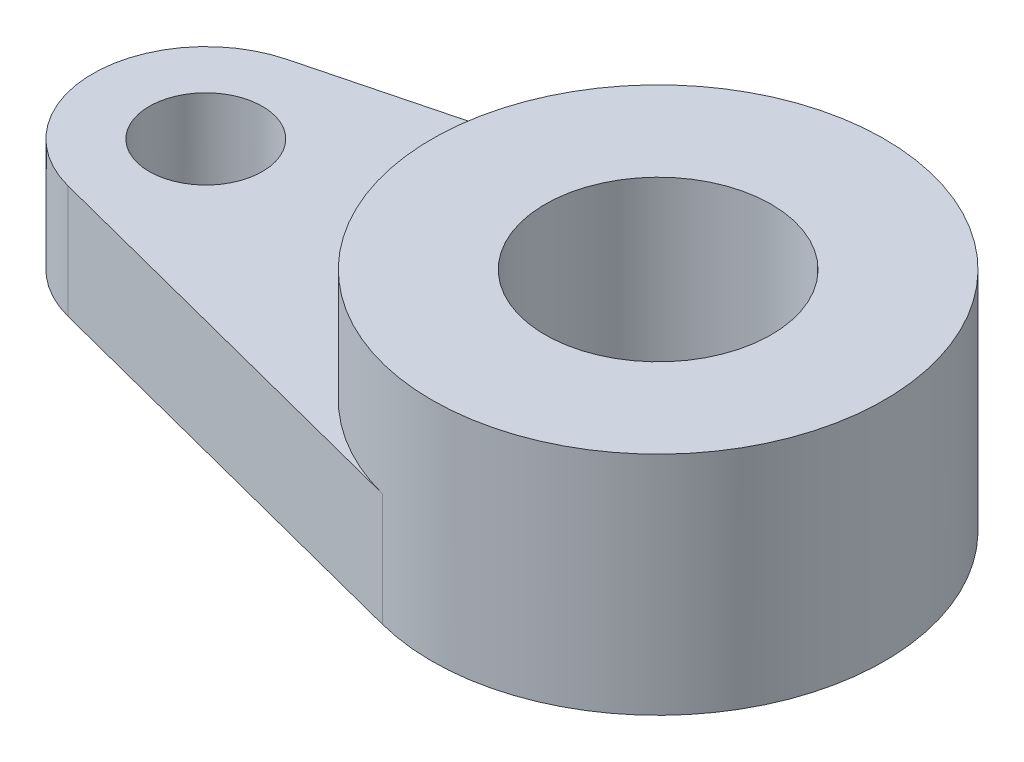
ISO-10303-21;
HEADER;
FILE_DESCRIPTION(('STEP AP214'),'2;1');
FILE_NAME('part.step','',(''),(''),'','','');
FILE_SCHEMA(('AUTOMOTIVE_DESIGN { 1 0 10303 214 1 1 1 1 }'));
ENDSEC;
DATA;
#1=APPLICATION_CONTEXT('core data for automotive mechanical design processes');
#2=APPLICATION_PROTOCOL_DEFINITION('international standard','automotive_design',2000,#1);
#3=PRODUCT_CONTEXT('',#1,'mechanical');
#4=PRODUCT('Part','Part','',(#3));
#5=PRODUCT_RELATED_PRODUCT_CATEGORY('part','',(#4));
#6=PRODUCT_DEFINITION_FORMATION('','',#4);
#7=PRODUCT_DEFINITION_CONTEXT('part definition',#1,'design');
#8=PRODUCT_DEFINITION('design','',#6,#7);
#9=PRODUCT_DEFINITION_SHAPE('','',#8);
#10=(LENGTH_UNIT() NAMED_UNIT(*) SI_UNIT(.MILLI.,.METRE.));
#11=(NAMED_UNIT(*) PLANE_ANGLE_UNIT() SI_UNIT($,.RADIAN.));
#12=(NAMED_UNIT(*) SI_UNIT($,.STERADIAN.) SOLID_ANGLE_UNIT());
#13=UNCERTAINTY_MEASURE_WITH_UNIT(LENGTH_MEASURE(1.E-05),#10,'distance_accuracy_value','');
#14=(GEOMETRIC_REPRESENTATION_CONTEXT(3) GLOBAL_UNCERTAINTY_ASSIGNED_CONTEXT((#13)) GLOBAL_UNIT_ASSIGNED_CONTEXT((#10,
#11,#12)) REPRESENTATION_CONTEXT('',''));
#15=CARTESIAN_POINT('',(0.,0.,0.));
#16=DIRECTION('',(0.,0.,1.));
#17=DIRECTION('',(1.,0.,0.));
#18=AXIS2_PLACEMENT_3D('',#15,#16,#17);
#19=CARTESIAN_POINT('',(0.,6.,0.));
#20=DIRECTION('',(0.,-1.,0.));
#21=DIRECTION('',(0.,0.,-1.));
#22=AXIS2_PLACEMENT_3D('',#19,#20,#21);
#23=CYLINDRICAL_SURFACE('',#22,6.);
#24=CARTESIAN_POINT('',(0.,6.,0.));
#25=DIRECTION('',(0.,1.,0.));
#26=DIRECTION('',(0.,0.,1.));
#27=AXIS2_PLACEMENT_3D('',#24,#25,#26);
#28=CIRCLE('',#27,6.);
#29=CARTESIAN_POINT('',(0.,6.,6.));
#30=VERTEX_POINT('',#29);
#31=EDGE_CURVE('E11',#30,#30,#28,.T.);
#32=ORIENTED_EDGE('',*,*,#31,.F.);
#33=EDGE_LOOP('',(#32));
#34=FACE_BOUND('',#33,.T.);
#35=DIRECTION('',(0.,-1.,0.));
#36=VECTOR('',#35,1.);
#37=CARTESIAN_POINT('',(-1.5,3.,-5.80947501931113));
#38=LINE('',#37,#36);
#39=CARTESIAN_POINT('',(-1.5,3.,-5.80947501931113));
#40=VERTEX_POINT('',#39);
#41=CARTESIAN_POINT('',(-1.5,0.,-5.80947501931113));
#42=VERTEX_POINT('',#41);
#43=EDGE_CURVE('E63',#40,#42,#38,.T.);
#44=ORIENTED_EDGE('',*,*,#43,.F.);
#45=CARTESIAN_POINT('',(0.,3.,0.));
#46=DIRECTION('',(0.,1.,0.));
#47=DIRECTION('',(0.,0.,1.));
#48=AXIS2_PLACEMENT_3D('',#45,#46,#47);
#49=CIRCLE('',#48,6.);
#50=CARTESIAN_POINT('',(-1.5,3.,5.80947501931113));
#51=VERTEX_POINT('',#50);
#52=EDGE_CURVE('E58',#40,#51,#49,.T.);
#53=ORIENTED_EDGE('',*,*,#52,.T.);
#54=DIRECTION('',(0.,-1.,0.));
#55=VECTOR('',#54,1.);
#56=CARTESIAN_POINT('',(-1.5,3.,5.80947501931113));
#57=LINE('',#56,#55);
#58=CARTESIAN_POINT('',(-1.5,0.,5.80947501931113));
#59=VERTEX_POINT('',#58);
#60=EDGE_CURVE('E126',#51,#59,#57,.T.);
#61=ORIENTED_EDGE('',*,*,#60,.T.);
#62=CARTESIAN_POINT('',(0.,0.,0.));
#63=DIRECTION('',(0.,1.,0.));
#64=DIRECTION('',(0.,0.,1.));
#65=AXIS2_PLACEMENT_3D('',#62,#63,#64);
#66=CIRCLE('',#65,6.);
#67=EDGE_CURVE('E50',#59,#42,#66,.T.);
#68=ORIENTED_EDGE('',*,*,#67,.T.);
#69=EDGE_LOOP('',(#44,#53,#61,#68));
#70=FACE_BOUND('',#69,.T.);
#71=ADVANCED_FACE('F41',(#34,#70),#23,.T.);
#72=CARTESIAN_POINT('',(0.,6.,0.));
#73=DIRECTION('',(0.,1.,0.));
#74=DIRECTION('',(0.,0.,1.));
#75=AXIS2_PLACEMENT_3D('',#72,#73,#74);
#76=PLANE('',#75);
#77=CARTESIAN_POINT('',(0.,6.,0.));
#78=DIRECTION('',(0.,-1.,0.));
#79=DIRECTION('',(0.,0.,-1.));
#80=AXIS2_PLACEMENT_3D('',#77,#78,#79);
#81=CIRCLE('',#80,3.);
#82=CARTESIAN_POINT('',(0.,6.,-3.));
#83=VERTEX_POINT('',#82);
#84=EDGE_CURVE('E221',#83,#83,#81,.T.);
#85=ORIENTED_EDGE('',*,*,#84,.T.);
#86=EDGE_LOOP('',(#85));
#87=FACE_BOUND('',#86,.T.);
#88=ORIENTED_EDGE('',*,*,#31,.T.);
#89=EDGE_LOOP('',(#88));
#90=FACE_BOUND('',#89,.T.);
#91=ADVANCED_FACE('F148',(#87,#90),#76,.T.);
#92=CARTESIAN_POINT('',(0.,0.,0.));
#93=DIRECTION('',(0.,1.,0.));
#94=DIRECTION('',(0.,0.,1.));
#95=AXIS2_PLACEMENT_3D('',#92,#93,#94);
#96=PLANE('',#95);
#97=CARTESIAN_POINT('',(0.,0.,0.));
#98=DIRECTION('',(0.,-1.,0.));
#99=DIRECTION('',(0.,0.,-1.));
#100=AXIS2_PLACEMENT_3D('',#97,#98,#99);
#101=CIRCLE('',#100,3.);
#102=CARTESIAN_POINT('',(0.,0.,-3.));
#103=VERTEX_POINT('',#102);
#104=EDGE_CURVE('E219',#103,#103,#101,.T.);
#105=ORIENTED_EDGE('',*,*,#104,.F.);
#106=EDGE_LOOP('',(#105));
#107=FACE_BOUND('',#106,.T.);
#108=CARTESIAN_POINT('',(-12.,0.,0.));
#109=DIRECTION('',(0.,-1.,0.));
#110=DIRECTION('',(0.,0.,-1.));
#111=AXIS2_PLACEMENT_3D('',#108,#109,#110);
#112=CIRCLE('',#111,1.5);
#113=CARTESIAN_POINT('',(-12.,0.,-1.5));
#114=VERTEX_POINT('',#113);
#115=EDGE_CURVE('E113',#114,#114,#112,.T.);
#116=ORIENTED_EDGE('',*,*,#115,.F.);
#117=EDGE_LOOP('',(#116));
#118=FACE_BOUND('',#117,.T.);
#119=ORIENTED_EDGE('',*,*,#67,.F.);
#120=DIRECTION('',(0.968245836551854,0.,0.25));
#121=VECTOR('',#120,1.);
#122=CARTESIAN_POINT('',(-1.5,0.,5.80947501931113));
#123=LINE('',#122,#121);
#124=CARTESIAN_POINT('',(-12.75,0.,2.90473750965556));
#125=VERTEX_POINT('',#124);
#126=EDGE_CURVE('E106',#125,#59,#123,.T.);
#127=ORIENTED_EDGE('',*,*,#126,.F.);
#128=CARTESIAN_POINT('',(-12.,0.,0.));
#129=DIRECTION('',(0.,1.,0.));
#130=DIRECTION('',(0.,0.,1.));
#131=AXIS2_PLACEMENT_3D('',#128,#129,#130);
#132=CIRCLE('',#131,3.);
#133=CARTESIAN_POINT('',(-12.75,0.,-2.90473750965556));
#134=VERTEX_POINT('',#133);
#135=EDGE_CURVE('E110',#134,#125,#132,.T.);
#136=ORIENTED_EDGE('',*,*,#135,.F.);
#137=DIRECTION('',(0.968245836551854,0.,-0.25));
#138=VECTOR('',#137,1.);
#139=CARTESIAN_POINT('',(-1.5,0.,-5.80947501931113));
#140=LINE('',#139,#138);
#141=EDGE_CURVE('E89',#134,#42,#140,.T.);
#142=ORIENTED_EDGE('',*,*,#141,.T.);
#143=EDGE_LOOP('',(#119,#127,#136,#142));
#144=FACE_BOUND('',#143,.T.);
#145=ADVANCED_FACE('F134',(#107,#118,#144),#96,.F.);
#146=CARTESIAN_POINT('',(-1.5,3.,-5.80947501931113));
#147=DIRECTION('',(-0.25,0.,-0.968245836551854));
#148=DIRECTION('',(-0.968245836551854,0.,0.25));
#149=AXIS2_PLACEMENT_3D('',#146,#147,#148);
#150=PLANE('',#149);
#151=ORIENTED_EDGE('',*,*,#141,.F.);
#152=DIRECTION('',(0.,-1.,0.));
#153=VECTOR('',#152,1.);
#154=CARTESIAN_POINT('',(-12.75,3.,-2.90473750965556));
#155=LINE('',#154,#153);
#156=CARTESIAN_POINT('',(-12.75,3.,-2.90473750965556));
#157=VERTEX_POINT('',#156);
#158=EDGE_CURVE('E83',#157,#134,#155,.T.);
#159=ORIENTED_EDGE('',*,*,#158,.F.);
#160=DIRECTION('',(0.968245836551854,0.,-0.25));
#161=VECTOR('',#160,1.);
#162=CARTESIAN_POINT('',(-1.5,3.,-5.80947501931113));
#163=LINE('',#162,#161);
#164=EDGE_CURVE('E87',#157,#40,#163,.T.);
#165=ORIENTED_EDGE('',*,*,#164,.T.);
#166=ORIENTED_EDGE('',*,*,#43,.T.);
#167=EDGE_LOOP('',(#151,#159,#165,#166));
#168=FACE_BOUND('',#167,.T.);
#169=ADVANCED_FACE('F85',(#168),#150,.T.);
#170=CARTESIAN_POINT('',(-12.,3.,0.));
#171=DIRECTION('',(0.,-1.,0.));
#172=DIRECTION('',(0.,0.,-1.));
#173=AXIS2_PLACEMENT_3D('',#170,#171,#172);
#174=CYLINDRICAL_SURFACE('',#173,3.);
#175=ORIENTED_EDGE('',*,*,#135,.T.);
#176=DIRECTION('',(0.,-1.,0.));
#177=VECTOR('',#176,1.);
#178=CARTESIAN_POINT('',(-12.75,3.,2.90473750965556));
#179=LINE('',#178,#177);
#180=CARTESIAN_POINT('',(-12.75,3.,2.90473750965556));
#181=VERTEX_POINT('',#180);
#182=EDGE_CURVE('E93',#181,#125,#179,.T.);
#183=ORIENTED_EDGE('',*,*,#182,.F.);
#184=CARTESIAN_POINT('',(-12.,3.,0.));
#185=DIRECTION('',(0.,1.,0.));
#186=DIRECTION('',(0.,0.,1.));
#187=AXIS2_PLACEMENT_3D('',#184,#185,#186);
#188=CIRCLE('',#187,3.);
#189=EDGE_CURVE('E96',#157,#181,#188,.T.);
#190=ORIENTED_EDGE('',*,*,#189,.F.);
#191=ORIENTED_EDGE('',*,*,#158,.T.);
#192=EDGE_LOOP('',(#175,#183,#190,#191));
#193=FACE_BOUND('',#192,.T.);
#194=ADVANCED_FACE('F97',(#193),#174,.T.);
#195=CARTESIAN_POINT('',(-1.5,3.,5.80947501931113));
#196=DIRECTION('',(0.25,0.,-0.968245836551854));
#197=DIRECTION('',(-0.968245836551854,0.,-0.25));
#198=AXIS2_PLACEMENT_3D('',#195,#196,#197);
#199=PLANE('',#198);
#200=ORIENTED_EDGE('',*,*,#126,.T.);
#201=ORIENTED_EDGE('',*,*,#60,.F.);
#202=DIRECTION('',(0.968245836551854,0.,0.25));
#203=VECTOR('',#202,1.);
#204=CARTESIAN_POINT('',(-1.5,3.,5.80947501931113));
#205=LINE('',#204,#203);
#206=EDGE_CURVE('E102',#181,#51,#205,.T.);
#207=ORIENTED_EDGE('',*,*,#206,.F.);
#208=ORIENTED_EDGE('',*,*,#182,.T.);
#209=EDGE_LOOP('',(#200,#201,#207,#208));
#210=FACE_BOUND('',#209,.T.);
#211=ADVANCED_FACE('F136',(#210),#199,.F.);
#212=CARTESIAN_POINT('',(0.,3.,0.));
#213=DIRECTION('',(0.,1.,0.));
#214=DIRECTION('',(0.,0.,1.));
#215=AXIS2_PLACEMENT_3D('',#212,#213,#214);
#216=PLANE('',#215);
#217=CARTESIAN_POINT('',(-12.,3.,0.));
#218=DIRECTION('',(0.,1.,0.));
#219=DIRECTION('',(0.,0.,1.));
#220=AXIS2_PLACEMENT_3D('',#217,#218,#219);
#221=CIRCLE('',#220,1.5);
#222=CARTESIAN_POINT('',(-12.,3.,1.5));
#223=VERTEX_POINT('',#222);
#224=EDGE_CURVE('E44',#223,#223,#221,.F.);
#225=ORIENTED_EDGE('',*,*,#224,.T.);
#226=EDGE_LOOP('',(#225));
#227=FACE_BOUND('',#226,.T.);
#228=ORIENTED_EDGE('',*,*,#164,.F.);
#229=ORIENTED_EDGE('',*,*,#189,.T.);
#230=ORIENTED_EDGE('',*,*,#206,.T.);
#231=ORIENTED_EDGE('',*,*,#52,.F.);
#232=EDGE_LOOP('',(#228,#229,#230,#231));
#233=FACE_BOUND('',#232,.T.);
#234=ADVANCED_FACE('F104',(#227,#233),#216,.T.);
#235=CARTESIAN_POINT('',(-12.,0.,0.));
#236=DIRECTION('',(0.,1.,0.));
#237=DIRECTION('',(0.,0.,1.));
#238=AXIS2_PLACEMENT_3D('',#235,#236,#237);
#239=CYLINDRICAL_SURFACE('',#238,1.5);
#240=ORIENTED_EDGE('',*,*,#224,.F.);
#241=EDGE_LOOP('',(#240));
#242=FACE_BOUND('',#241,.T.);
#243=ORIENTED_EDGE('',*,*,#115,.T.);
#244=EDGE_LOOP('',(#243));
#245=FACE_BOUND('',#244,.T.);
#246=ADVANCED_FACE('F143',(#242,#245),#239,.F.);
#247=CARTESIAN_POINT('',(0.,0.,0.));
#248=DIRECTION('',(0.,1.,0.));
#249=DIRECTION('',(0.,0.,1.));
#250=AXIS2_PLACEMENT_3D('',#247,#248,#249);
#251=CYLINDRICAL_SURFACE('',#250,3.);
#252=ORIENTED_EDGE('',*,*,#104,.T.);
#253=EDGE_LOOP('',(#252));
#254=FACE_BOUND('',#253,.T.);
#255=ORIENTED_EDGE('',*,*,#84,.F.);
#256=EDGE_LOOP('',(#255));
#257=FACE_BOUND('',#256,.T.);
#258=ADVANCED_FACE('F202',(#254,#257),#251,.F.);
#259=CLOSED_SHELL('',(#71,#91,#145,#169,#194,#211,#234,#246,#258));
#260=MANIFOLD_SOLID_BREP('B2',#259);
#261=ADVANCED_BREP_SHAPE_REPRESENTATION('',(#18,#260),#14);
#262=SHAPE_DEFINITION_REPRESENTATION(#9,#261);
ENDSEC;
END-ISO-10303-21;
